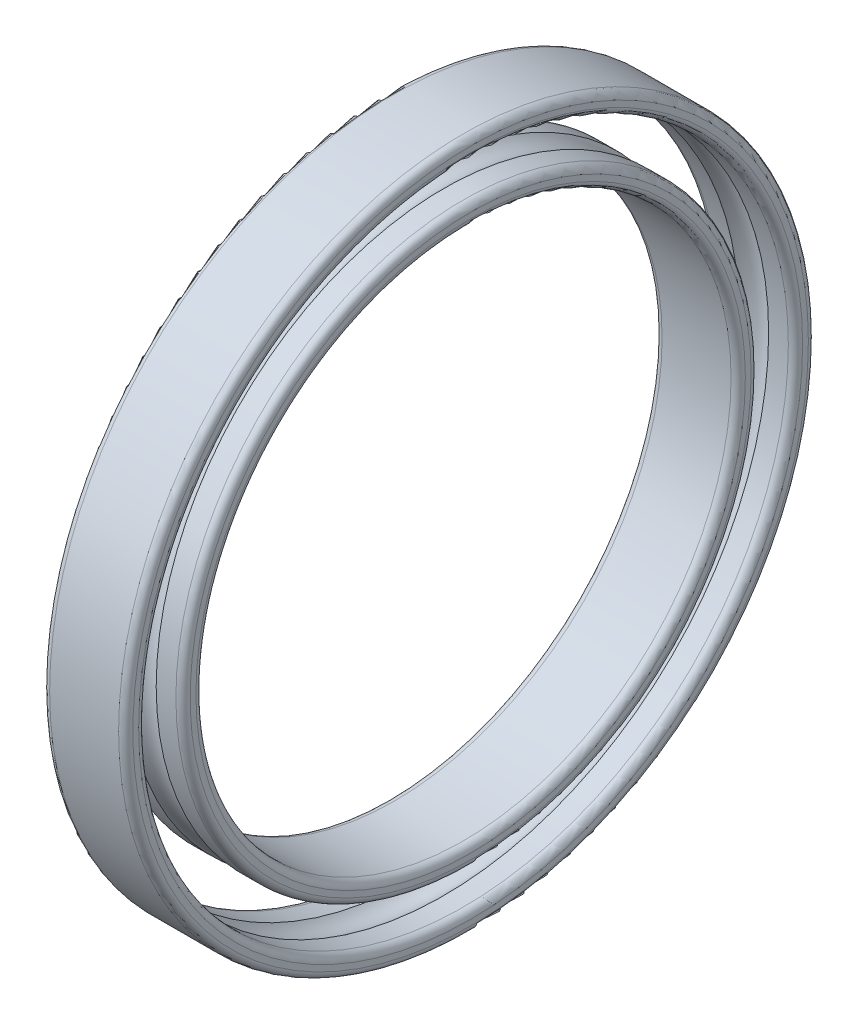
ISO-10303-21;
HEADER;
FILE_DESCRIPTION(('STEP AP214'),'2;1');
FILE_NAME('part.step','',(''),(''),'','','');
FILE_SCHEMA(('AUTOMOTIVE_DESIGN { 1 0 10303 214 1 1 1 1 }'));
ENDSEC;
DATA;
#1=APPLICATION_CONTEXT('core data for automotive mechanical design processes');
#2=APPLICATION_PROTOCOL_DEFINITION('international standard','automotive_design',2000,#1);
#3=PRODUCT_CONTEXT('',#1,'mechanical');
#4=PRODUCT('Part','Part','',(#3));
#5=PRODUCT_RELATED_PRODUCT_CATEGORY('part','',(#4));
#6=PRODUCT_DEFINITION_FORMATION('','',#4);
#7=PRODUCT_DEFINITION_CONTEXT('part definition',#1,'design');
#8=PRODUCT_DEFINITION('design','',#6,#7);
#9=PRODUCT_DEFINITION_SHAPE('','',#8);
#10=(LENGTH_UNIT() NAMED_UNIT(*) SI_UNIT(.MILLI.,.METRE.));
#11=(NAMED_UNIT(*) PLANE_ANGLE_UNIT() SI_UNIT($,.RADIAN.));
#12=(NAMED_UNIT(*) SI_UNIT($,.STERADIAN.) SOLID_ANGLE_UNIT());
#13=UNCERTAINTY_MEASURE_WITH_UNIT(LENGTH_MEASURE(1.E-05),#10,'distance_accuracy_value','');
#14=(GEOMETRIC_REPRESENTATION_CONTEXT(3) GLOBAL_UNCERTAINTY_ASSIGNED_CONTEXT((#13)) GLOBAL_UNIT_ASSIGNED_CONTEXT((#10,
#11,#12)) REPRESENTATION_CONTEXT('',''));
#15=CARTESIAN_POINT('',(0.,0.,0.));
#16=DIRECTION('',(0.,0.,1.));
#17=DIRECTION('',(1.,0.,0.));
#18=AXIS2_PLACEMENT_3D('',#15,#16,#17);
#19=CARTESIAN_POINT('',(-3.5,29.,0.));
#20=DIRECTION('',(-1.,0.,0.));
#21=DIRECTION('',(0.,0.,1.));
#22=AXIS2_PLACEMENT_3D('',#19,#20,#21);
#23=PLANE('',#22);
#24=CARTESIAN_POINT('',(-3.5,0.,0.));
#25=DIRECTION('',(-1.,0.,0.));
#26=DIRECTION('',(0.,0.,1.));
#27=AXIS2_PLACEMENT_3D('',#24,#25,#26);
#28=CIRCLE('',#27,28.4);
#29=CARTESIAN_POINT('',(-3.5,0.,28.4));
#30=VERTEX_POINT('',#29);
#31=EDGE_CURVE('E11',#30,#30,#28,.T.);
#32=ORIENTED_EDGE('',*,*,#31,.T.);
#33=EDGE_LOOP('',(#32));
#34=FACE_BOUND('',#33,.T.);
#35=CARTESIAN_POINT('',(-3.5,0.,0.));
#36=DIRECTION('',(-1.,0.,0.));
#37=DIRECTION('',(0.,0.,1.));
#38=AXIS2_PLACEMENT_3D('',#35,#36,#37);
#39=CIRCLE('',#38,27.9157443017127);
#40=CARTESIAN_POINT('',(-3.5,0.,27.9157443017127));
#41=VERTEX_POINT('',#40);
#42=EDGE_CURVE('E69',#41,#41,#39,.F.);
#43=ORIENTED_EDGE('',*,*,#42,.T.);
#44=EDGE_LOOP('',(#43));
#45=FACE_BOUND('',#44,.T.);
#46=ADVANCED_FACE('F45',(#34,#45),#23,.T.);
#47=CARTESIAN_POINT('',(0.,0.,0.));
#48=DIRECTION('',(1.,0.,0.));
#49=DIRECTION('',(0.,0.,-1.));
#50=AXIS2_PLACEMENT_3D('',#47,#48,#49);
#51=CYLINDRICAL_SURFACE('',#50,27.3157443017127);
#52=CARTESIAN_POINT('',(-2.9,0.,0.));
#53=DIRECTION('',(-1.,0.,0.));
#54=DIRECTION('',(0.,0.,1.));
#55=AXIS2_PLACEMENT_3D('',#52,#53,#54);
#56=CIRCLE('',#55,27.3157443017127);
#57=CARTESIAN_POINT('',(-2.9,0.,27.3157443017127));
#58=VERTEX_POINT('',#57);
#59=EDGE_CURVE('E63',#58,#58,#56,.T.);
#60=ORIENTED_EDGE('',*,*,#59,.T.);
#61=EDGE_LOOP('',(#60));
#62=FACE_BOUND('',#61,.T.);
#63=CARTESIAN_POINT('',(-1.24436521232881,0.,0.));
#64=DIRECTION('',(1.,0.,0.));
#65=DIRECTION('',(0.,0.,-1.));
#66=AXIS2_PLACEMENT_3D('',#63,#64,#65);
#67=CIRCLE('',#66,27.3157443017127);
#68=CARTESIAN_POINT('',(-1.24436521232881,0.,-27.3157443017127));
#69=VERTEX_POINT('',#68);
#70=EDGE_CURVE('E85',#69,#69,#67,.T.);
#71=ORIENTED_EDGE('',*,*,#70,.T.);
#72=EDGE_LOOP('',(#71));
#73=FACE_BOUND('',#72,.T.);
#74=ADVANCED_FACE('F109',(#62,#73),#51,.F.);
#75=CARTESIAN_POINT('',(0.,0.,0.));
#76=DIRECTION('',(1.,0.,0.));
#77=DIRECTION('',(0.,0.,-1.));
#78=AXIS2_PLACEMENT_3D('',#75,#76,#77);
#79=TOROIDAL_SURFACE('',#78,25.75,2.);
#80=CARTESIAN_POINT('',(1.24436521232881,0.,0.));
#81=DIRECTION('',(1.,0.,0.));
#82=DIRECTION('',(0.,0.,-1.));
#83=AXIS2_PLACEMENT_3D('',#80,#81,#82);
#84=CIRCLE('',#83,27.3157443017127);
#85=CARTESIAN_POINT('',(1.24436521232881,0.,-27.3157443017127));
#86=VERTEX_POINT('',#85);
#87=EDGE_CURVE('E89',#86,#86,#84,.T.);
#88=ORIENTED_EDGE('',*,*,#87,.T.);
#89=EDGE_LOOP('',(#88));
#90=FACE_BOUND('',#89,.T.);
#91=ORIENTED_EDGE('',*,*,#70,.F.);
#92=EDGE_LOOP('',(#91));
#93=FACE_BOUND('',#92,.T.);
#94=ADVANCED_FACE('F94',(#90,#93),#79,.F.);
#95=CARTESIAN_POINT('',(0.,0.,0.));
#96=DIRECTION('',(1.,0.,0.));
#97=DIRECTION('',(0.,0.,-1.));
#98=AXIS2_PLACEMENT_3D('',#95,#96,#97);
#99=CYLINDRICAL_SURFACE('',#98,27.3157443017127);
#100=CARTESIAN_POINT('',(2.9,0.,0.));
#101=DIRECTION('',(1.,0.,0.));
#102=DIRECTION('',(0.,0.,-1.));
#103=AXIS2_PLACEMENT_3D('',#100,#101,#102);
#104=CIRCLE('',#103,27.3157443017127);
#105=CARTESIAN_POINT('',(2.9,0.,-27.3157443017127));
#106=VERTEX_POINT('',#105);
#107=EDGE_CURVE('E58',#106,#106,#104,.T.);
#108=ORIENTED_EDGE('',*,*,#107,.T.);
#109=EDGE_LOOP('',(#108));
#110=FACE_BOUND('',#109,.T.);
#111=ORIENTED_EDGE('',*,*,#87,.F.);
#112=EDGE_LOOP('',(#111));
#113=FACE_BOUND('',#112,.T.);
#114=ADVANCED_FACE('F97',(#110,#113),#99,.F.);
#115=CARTESIAN_POINT('',(3.5,29.,0.));
#116=DIRECTION('',(1.,0.,0.));
#117=DIRECTION('',(0.,0.,-1.));
#118=AXIS2_PLACEMENT_3D('',#115,#116,#117);
#119=PLANE('',#118);
#120=CARTESIAN_POINT('',(3.5,0.,0.));
#121=DIRECTION('',(1.,0.,0.));
#122=DIRECTION('',(0.,0.,-1.));
#123=AXIS2_PLACEMENT_3D('',#120,#121,#122);
#124=CIRCLE('',#123,28.4);
#125=CARTESIAN_POINT('',(3.5,0.,-28.4));
#126=VERTEX_POINT('',#125);
#127=EDGE_CURVE('E77',#126,#126,#124,.T.);
#128=ORIENTED_EDGE('',*,*,#127,.T.);
#129=EDGE_LOOP('',(#128));
#130=FACE_BOUND('',#129,.T.);
#131=CARTESIAN_POINT('',(3.5,0.,0.));
#132=DIRECTION('',(1.,0.,0.));
#133=DIRECTION('',(0.,0.,-1.));
#134=AXIS2_PLACEMENT_3D('',#131,#132,#133);
#135=CIRCLE('',#134,27.9157443017127);
#136=CARTESIAN_POINT('',(3.5,0.,-27.9157443017127));
#137=VERTEX_POINT('',#136);
#138=EDGE_CURVE('E81',#137,#137,#135,.F.);
#139=ORIENTED_EDGE('',*,*,#138,.T.);
#140=EDGE_LOOP('',(#139));
#141=FACE_BOUND('',#140,.T.);
#142=ADVANCED_FACE('F99',(#130,#141),#119,.T.);
#143=CARTESIAN_POINT('',(0.,0.,0.));
#144=DIRECTION('',(1.,0.,0.));
#145=DIRECTION('',(0.,0.,-1.));
#146=AXIS2_PLACEMENT_3D('',#143,#144,#145);
#147=CYLINDRICAL_SURFACE('',#146,29.);
#148=CARTESIAN_POINT('',(-2.9,0.,0.));
#149=DIRECTION('',(-1.,0.,0.));
#150=DIRECTION('',(0.,0.,1.));
#151=AXIS2_PLACEMENT_3D('',#148,#149,#150);
#152=CIRCLE('',#151,29.);
#153=CARTESIAN_POINT('',(-2.9,0.,29.));
#154=VERTEX_POINT('',#153);
#155=EDGE_CURVE('E53',#154,#154,#152,.F.);
#156=ORIENTED_EDGE('',*,*,#155,.T.);
#157=EDGE_LOOP('',(#156));
#158=FACE_BOUND('',#157,.T.);
#159=CARTESIAN_POINT('',(2.9,0.,0.));
#160=DIRECTION('',(1.,0.,0.));
#161=DIRECTION('',(0.,0.,-1.));
#162=AXIS2_PLACEMENT_3D('',#159,#160,#161);
#163=CIRCLE('',#162,29.);
#164=CARTESIAN_POINT('',(2.9,0.,-29.));
#165=VERTEX_POINT('',#164);
#166=EDGE_CURVE('E73',#165,#165,#163,.F.);
#167=ORIENTED_EDGE('',*,*,#166,.T.);
#168=EDGE_LOOP('',(#167));
#169=FACE_BOUND('',#168,.T.);
#170=ADVANCED_FACE('F106',(#158,#169),#147,.T.);
#171=CARTESIAN_POINT('',(2.9,0.,0.));
#172=DIRECTION('',(1.,0.,0.));
#173=DIRECTION('',(0.,0.,-1.));
#174=AXIS2_PLACEMENT_3D('',#171,#172,#173);
#175=TOROIDAL_SURFACE('',#174,28.4,0.6);
#176=ORIENTED_EDGE('',*,*,#166,.F.);
#177=EDGE_LOOP('',(#176));
#178=FACE_BOUND('',#177,.T.);
#179=ORIENTED_EDGE('',*,*,#127,.F.);
#180=EDGE_LOOP('',(#179));
#181=FACE_BOUND('',#180,.T.);
#182=ADVANCED_FACE('F120',(#178,#181),#175,.T.);
#183=CARTESIAN_POINT('',(-2.9,0.,0.));
#184=DIRECTION('',(-1.,0.,0.));
#185=DIRECTION('',(0.,0.,1.));
#186=AXIS2_PLACEMENT_3D('',#183,#184,#185);
#187=TOROIDAL_SURFACE('',#186,27.9157443017127,0.6);
#188=ORIENTED_EDGE('',*,*,#59,.F.);
#189=EDGE_LOOP('',(#188));
#190=FACE_BOUND('',#189,.T.);
#191=ORIENTED_EDGE('',*,*,#42,.F.);
#192=EDGE_LOOP('',(#191));
#193=FACE_BOUND('',#192,.T.);
#194=ADVANCED_FACE('F123',(#190,#193),#187,.T.);
#195=CARTESIAN_POINT('',(2.9,0.,0.));
#196=DIRECTION('',(1.,0.,0.));
#197=DIRECTION('',(0.,0.,-1.));
#198=AXIS2_PLACEMENT_3D('',#195,#196,#197);
#199=TOROIDAL_SURFACE('',#198,27.9157443017127,0.6);
#200=ORIENTED_EDGE('',*,*,#138,.F.);
#201=EDGE_LOOP('',(#200));
#202=FACE_BOUND('',#201,.T.);
#203=ORIENTED_EDGE('',*,*,#107,.F.);
#204=EDGE_LOOP('',(#203));
#205=FACE_BOUND('',#204,.T.);
#206=ADVANCED_FACE('F126',(#202,#205),#199,.T.);
#207=CARTESIAN_POINT('',(-2.9,0.,0.));
#208=DIRECTION('',(-1.,0.,0.));
#209=DIRECTION('',(0.,0.,1.));
#210=AXIS2_PLACEMENT_3D('',#207,#208,#209);
#211=TOROIDAL_SURFACE('',#210,28.4,0.6);
#212=ORIENTED_EDGE('',*,*,#31,.F.);
#213=EDGE_LOOP('',(#212));
#214=FACE_BOUND('',#213,.T.);
#215=ORIENTED_EDGE('',*,*,#155,.F.);
#216=EDGE_LOOP('',(#215));
#217=FACE_BOUND('',#216,.T.);
#218=ADVANCED_FACE('F47',(#214,#217),#211,.T.);
#219=CLOSED_SHELL('',(#46,#74,#94,#114,#142,#170,#182,#194,#206,#218));
#220=MANIFOLD_SOLID_BREP('B2',#219);
#221=CARTESIAN_POINT('',(3.5,24.1842556982873,0.));
#222=DIRECTION('',(1.,0.,0.));
#223=DIRECTION('',(0.,0.,-1.));
#224=AXIS2_PLACEMENT_3D('',#221,#222,#223);
#225=PLANE('',#224);
#226=CARTESIAN_POINT('',(3.5,0.,0.));
#227=DIRECTION('',(1.,0.,0.));
#228=DIRECTION('',(0.,0.,-1.));
#229=AXIS2_PLACEMENT_3D('',#226,#227,#228);
#230=CIRCLE('',#229,23.5842556982873);
#231=CARTESIAN_POINT('',(3.5,0.,-23.5842556982873));
#232=VERTEX_POINT('',#231);
#233=EDGE_CURVE('E214',#232,#232,#230,.T.);
#234=ORIENTED_EDGE('',*,*,#233,.T.);
#235=EDGE_LOOP('',(#234));
#236=FACE_BOUND('',#235,.T.);
#237=CARTESIAN_POINT('',(3.5,0.,0.));
#238=DIRECTION('',(1.,0.,0.));
#239=DIRECTION('',(0.,0.,-1.));
#240=AXIS2_PLACEMENT_3D('',#237,#238,#239);
#241=CIRCLE('',#240,23.1);
#242=CARTESIAN_POINT('',(3.5,0.,-23.1));
#243=VERTEX_POINT('',#242);
#244=EDGE_CURVE('E218',#243,#243,#241,.F.);
#245=ORIENTED_EDGE('',*,*,#244,.T.);
#246=EDGE_LOOP('',(#245));
#247=FACE_BOUND('',#246,.T.);
#248=ADVANCED_FACE('F207',(#236,#247),#225,.T.);
#249=CARTESIAN_POINT('',(0.,0.,0.));
#250=DIRECTION('',(1.,0.,0.));
#251=DIRECTION('',(0.,0.,-1.));
#252=AXIS2_PLACEMENT_3D('',#249,#250,#251);
#253=CYLINDRICAL_SURFACE('',#252,24.1842556982873);
#254=CARTESIAN_POINT('',(2.9,0.,0.));
#255=DIRECTION('',(1.,0.,0.));
#256=DIRECTION('',(0.,0.,-1.));
#257=AXIS2_PLACEMENT_3D('',#254,#255,#256);
#258=CIRCLE('',#257,24.1842556982873);
#259=CARTESIAN_POINT('',(2.9,0.,-24.1842556982873));
#260=VERTEX_POINT('',#259);
#261=EDGE_CURVE('E44',#260,#260,#258,.F.);
#262=ORIENTED_EDGE('',*,*,#261,.T.);
#263=EDGE_LOOP('',(#262));
#264=FACE_BOUND('',#263,.T.);
#265=CARTESIAN_POINT('',(1.24436521232881,0.,0.));
#266=DIRECTION('',(1.,0.,0.));
#267=DIRECTION('',(0.,0.,-1.));
#268=AXIS2_PLACEMENT_3D('',#265,#266,#267);
#269=CIRCLE('',#268,24.1842556982873);
#270=CARTESIAN_POINT('',(1.24436521232881,0.,-24.1842556982873));
#271=VERTEX_POINT('',#270);
#272=EDGE_CURVE('E239',#271,#271,#269,.T.);
#273=ORIENTED_EDGE('',*,*,#272,.T.);
#274=EDGE_LOOP('',(#273));
#275=FACE_BOUND('',#274,.T.);
#276=ADVANCED_FACE('F261',(#264,#275),#253,.T.);
#277=CARTESIAN_POINT('',(0.,0.,0.));
#278=DIRECTION('',(1.,0.,0.));
#279=DIRECTION('',(0.,0.,-1.));
#280=AXIS2_PLACEMENT_3D('',#277,#278,#279);
#281=TOROIDAL_SURFACE('',#280,25.75,2.);
#282=CARTESIAN_POINT('',(-1.24436521232881,0.,0.));
#283=DIRECTION('',(1.,0.,0.));
#284=DIRECTION('',(0.,0.,-1.));
#285=AXIS2_PLACEMENT_3D('',#282,#283,#284);
#286=CIRCLE('',#285,24.1842556982873);
#287=CARTESIAN_POINT('',(-1.24436521232881,0.,-24.1842556982873));
#288=VERTEX_POINT('',#287);
#289=EDGE_CURVE('E242',#288,#288,#286,.T.);
#290=ORIENTED_EDGE('',*,*,#289,.T.);
#291=EDGE_LOOP('',(#290));
#292=FACE_BOUND('',#291,.T.);
#293=ORIENTED_EDGE('',*,*,#272,.F.);
#294=EDGE_LOOP('',(#293));
#295=FACE_BOUND('',#294,.T.);
#296=ADVANCED_FACE('F246',(#292,#295),#281,.F.);
#297=CARTESIAN_POINT('',(0.,0.,0.));
#298=DIRECTION('',(1.,0.,0.));
#299=DIRECTION('',(0.,0.,-1.));
#300=AXIS2_PLACEMENT_3D('',#297,#298,#299);
#301=CYLINDRICAL_SURFACE('',#300,24.1842556982873);
#302=CARTESIAN_POINT('',(-2.9,0.,0.));
#303=DIRECTION('',(-1.,0.,0.));
#304=DIRECTION('',(0.,0.,1.));
#305=AXIS2_PLACEMENT_3D('',#302,#303,#304);
#306=CIRCLE('',#305,24.1842556982873);
#307=CARTESIAN_POINT('',(-2.9,0.,24.1842556982873));
#308=VERTEX_POINT('',#307);
#309=EDGE_CURVE('E236',#308,#308,#306,.F.);
#310=ORIENTED_EDGE('',*,*,#309,.T.);
#311=EDGE_LOOP('',(#310));
#312=FACE_BOUND('',#311,.T.);
#313=ORIENTED_EDGE('',*,*,#289,.F.);
#314=EDGE_LOOP('',(#313));
#315=FACE_BOUND('',#314,.T.);
#316=ADVANCED_FACE('F249',(#312,#315),#301,.T.);
#317=CARTESIAN_POINT('',(-3.5,24.1842556982873,0.));
#318=DIRECTION('',(-1.,0.,0.));
#319=DIRECTION('',(0.,0.,1.));
#320=AXIS2_PLACEMENT_3D('',#317,#318,#319);
#321=PLANE('',#320);
#322=CARTESIAN_POINT('',(-3.5,0.,0.));
#323=DIRECTION('',(-1.,0.,0.));
#324=DIRECTION('',(0.,0.,1.));
#325=AXIS2_PLACEMENT_3D('',#322,#323,#324);
#326=CIRCLE('',#325,23.5842556982873);
#327=CARTESIAN_POINT('',(-3.5,0.,23.5842556982873));
#328=VERTEX_POINT('',#327);
#329=EDGE_CURVE('E230',#328,#328,#326,.T.);
#330=ORIENTED_EDGE('',*,*,#329,.T.);
#331=EDGE_LOOP('',(#330));
#332=FACE_BOUND('',#331,.T.);
#333=CARTESIAN_POINT('',(-3.5,0.,0.));
#334=DIRECTION('',(-1.,0.,0.));
#335=DIRECTION('',(0.,0.,1.));
#336=AXIS2_PLACEMENT_3D('',#333,#334,#335);
#337=CIRCLE('',#336,23.1);
#338=CARTESIAN_POINT('',(-3.5,0.,23.1));
#339=VERTEX_POINT('',#338);
#340=EDGE_CURVE('E233',#339,#339,#337,.F.);
#341=ORIENTED_EDGE('',*,*,#340,.T.);
#342=EDGE_LOOP('',(#341));
#343=FACE_BOUND('',#342,.T.);
#344=ADVANCED_FACE('F251',(#332,#343),#321,.T.);
#345=CARTESIAN_POINT('',(0.,0.,0.));
#346=DIRECTION('',(1.,0.,0.));
#347=DIRECTION('',(0.,0.,-1.));
#348=AXIS2_PLACEMENT_3D('',#345,#346,#347);
#349=CYLINDRICAL_SURFACE('',#348,22.5);
#350=CARTESIAN_POINT('',(-2.9,0.,0.));
#351=DIRECTION('',(-1.,0.,0.));
#352=DIRECTION('',(0.,0.,1.));
#353=AXIS2_PLACEMENT_3D('',#350,#351,#352);
#354=CIRCLE('',#353,22.5);
#355=CARTESIAN_POINT('',(-2.9,0.,22.5));
#356=VERTEX_POINT('',#355);
#357=EDGE_CURVE('E222',#356,#356,#354,.T.);
#358=ORIENTED_EDGE('',*,*,#357,.T.);
#359=EDGE_LOOP('',(#358));
#360=FACE_BOUND('',#359,.T.);
#361=CARTESIAN_POINT('',(2.9,0.,0.));
#362=DIRECTION('',(1.,0.,0.));
#363=DIRECTION('',(0.,0.,-1.));
#364=AXIS2_PLACEMENT_3D('',#361,#362,#363);
#365=CIRCLE('',#364,22.5);
#366=CARTESIAN_POINT('',(2.9,0.,-22.5));
#367=VERTEX_POINT('',#366);
#368=EDGE_CURVE('E227',#367,#367,#365,.T.);
#369=ORIENTED_EDGE('',*,*,#368,.T.);
#370=EDGE_LOOP('',(#369));
#371=FACE_BOUND('',#370,.T.);
#372=ADVANCED_FACE('F258',(#360,#371),#349,.F.);
#373=CARTESIAN_POINT('',(-2.9,0.,0.));
#374=DIRECTION('',(-1.,0.,0.));
#375=DIRECTION('',(0.,0.,1.));
#376=AXIS2_PLACEMENT_3D('',#373,#374,#375);
#377=TOROIDAL_SURFACE('',#376,23.5842556982873,0.6);
#378=ORIENTED_EDGE('',*,*,#329,.F.);
#379=EDGE_LOOP('',(#378));
#380=FACE_BOUND('',#379,.T.);
#381=ORIENTED_EDGE('',*,*,#309,.F.);
#382=EDGE_LOOP('',(#381));
#383=FACE_BOUND('',#382,.T.);
#384=ADVANCED_FACE('F271',(#380,#383),#377,.T.);
#385=CARTESIAN_POINT('',(-2.9,0.,0.));
#386=DIRECTION('',(-1.,0.,0.));
#387=DIRECTION('',(0.,0.,1.));
#388=AXIS2_PLACEMENT_3D('',#385,#386,#387);
#389=TOROIDAL_SURFACE('',#388,23.1,0.6);
#390=ORIENTED_EDGE('',*,*,#357,.F.);
#391=EDGE_LOOP('',(#390));
#392=FACE_BOUND('',#391,.T.);
#393=ORIENTED_EDGE('',*,*,#340,.F.);
#394=EDGE_LOOP('',(#393));
#395=FACE_BOUND('',#394,.T.);
#396=ADVANCED_FACE('F274',(#392,#395),#389,.T.);
#397=CARTESIAN_POINT('',(2.9,0.,0.));
#398=DIRECTION('',(1.,0.,0.));
#399=DIRECTION('',(0.,0.,-1.));
#400=AXIS2_PLACEMENT_3D('',#397,#398,#399);
#401=TOROIDAL_SURFACE('',#400,23.5842556982873,0.6);
#402=ORIENTED_EDGE('',*,*,#261,.F.);
#403=EDGE_LOOP('',(#402));
#404=FACE_BOUND('',#403,.T.);
#405=ORIENTED_EDGE('',*,*,#233,.F.);
#406=EDGE_LOOP('',(#405));
#407=FACE_BOUND('',#406,.T.);
#408=ADVANCED_FACE('F277',(#404,#407),#401,.T.);
#409=CARTESIAN_POINT('',(2.9,0.,0.));
#410=DIRECTION('',(1.,0.,0.));
#411=DIRECTION('',(0.,0.,-1.));
#412=AXIS2_PLACEMENT_3D('',#409,#410,#411);
#413=TOROIDAL_SURFACE('',#412,23.1,0.6);
#414=ORIENTED_EDGE('',*,*,#244,.F.);
#415=EDGE_LOOP('',(#414));
#416=FACE_BOUND('',#415,.T.);
#417=ORIENTED_EDGE('',*,*,#368,.F.);
#418=EDGE_LOOP('',(#417));
#419=FACE_BOUND('',#418,.T.);
#420=ADVANCED_FACE('F209',(#416,#419),#413,.T.);
#421=CLOSED_SHELL('',(#248,#276,#296,#316,#344,#372,#384,#396,#408,#420));
#422=MANIFOLD_SOLID_BREP('B6',#421);
#423=ADVANCED_BREP_SHAPE_REPRESENTATION('',(#18,#220,#422),#14);
#424=SHAPE_DEFINITION_REPRESENTATION(#9,#423);
ENDSEC;
END-ISO-10303-21;
